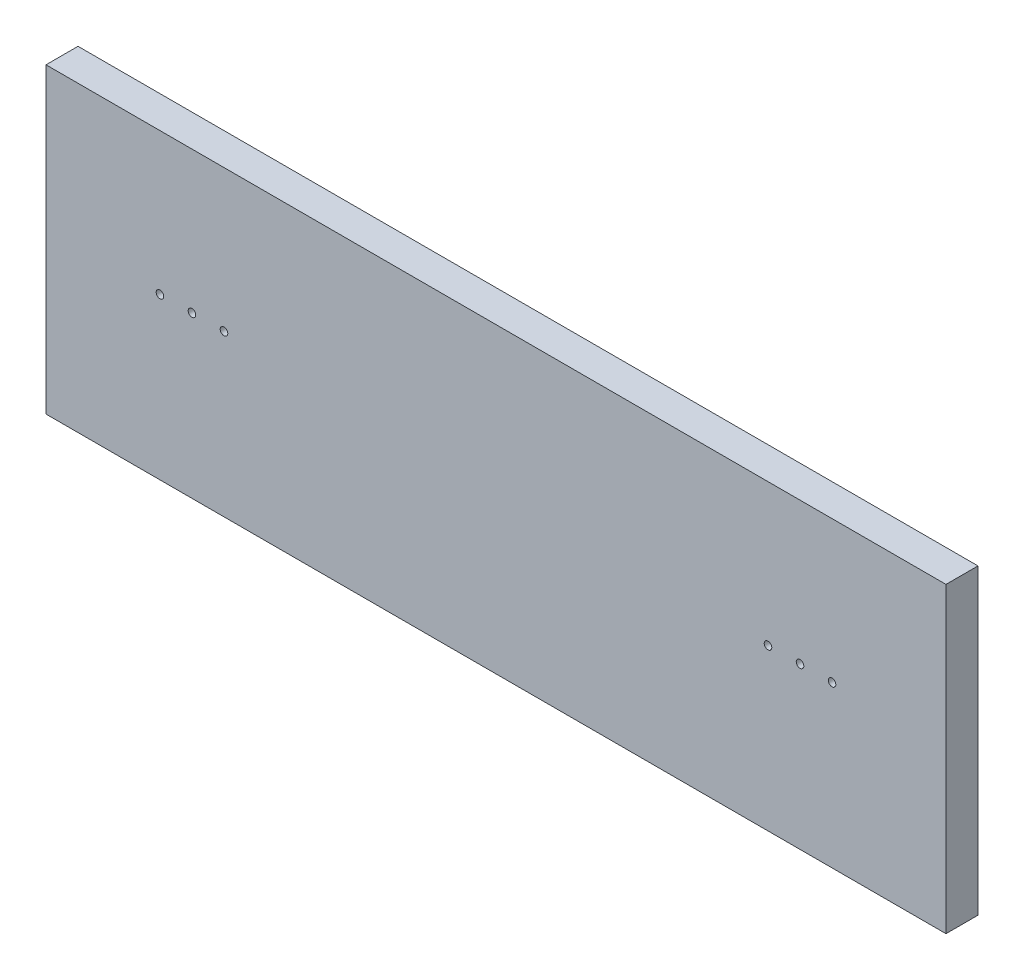
ISO-10303-21;
HEADER;
FILE_DESCRIPTION(('STEP AP214'),'2;1');
FILE_NAME('part.step','',(''),(''),'','','');
FILE_SCHEMA(('AUTOMOTIVE_DESIGN { 1 0 10303 214 1 1 1 1 }'));
ENDSEC;
DATA;
#1=APPLICATION_CONTEXT('core data for automotive mechanical design processes');
#2=APPLICATION_PROTOCOL_DEFINITION('international standard','automotive_design',2000,#1);
#3=PRODUCT_CONTEXT('',#1,'mechanical');
#4=PRODUCT('Part','Part','',(#3));
#5=PRODUCT_RELATED_PRODUCT_CATEGORY('part','',(#4));
#6=PRODUCT_DEFINITION_FORMATION('','',#4);
#7=PRODUCT_DEFINITION_CONTEXT('part definition',#1,'design');
#8=PRODUCT_DEFINITION('design','',#6,#7);
#9=PRODUCT_DEFINITION_SHAPE('','',#8);
#10=(LENGTH_UNIT() NAMED_UNIT(*) SI_UNIT(.MILLI.,.METRE.));
#11=(NAMED_UNIT(*) PLANE_ANGLE_UNIT() SI_UNIT($,.RADIAN.));
#12=(NAMED_UNIT(*) SI_UNIT($,.STERADIAN.) SOLID_ANGLE_UNIT());
#13=UNCERTAINTY_MEASURE_WITH_UNIT(LENGTH_MEASURE(1.E-05),#10,'distance_accuracy_value','');
#14=(GEOMETRIC_REPRESENTATION_CONTEXT(3) GLOBAL_UNCERTAINTY_ASSIGNED_CONTEXT((#13)) GLOBAL_UNIT_ASSIGNED_CONTEXT((#10,
#11,#12)) REPRESENTATION_CONTEXT('',''));
#15=CARTESIAN_POINT('',(0.,0.,0.));
#16=DIRECTION('',(0.,0.,1.));
#17=DIRECTION('',(1.,0.,0.));
#18=AXIS2_PLACEMENT_3D('',#15,#16,#17);
#19=CARTESIAN_POINT('',(178.5,60.,12.7));
#20=DIRECTION('',(-1.,0.,0.));
#21=DIRECTION('',(0.,-1.,0.));
#22=AXIS2_PLACEMENT_3D('',#19,#20,#21);
#23=PLANE('',#22);
#24=DIRECTION('',(0.,1.,0.));
#25=VECTOR('',#24,1.);
#26=CARTESIAN_POINT('',(178.5,60.,0.));
#27=LINE('',#26,#25);
#28=CARTESIAN_POINT('',(178.5,-60.,0.));
#29=VERTEX_POINT('',#28);
#30=CARTESIAN_POINT('',(178.5,60.,0.));
#31=VERTEX_POINT('',#30);
#32=EDGE_CURVE('E104',#29,#31,#27,.T.);
#33=ORIENTED_EDGE('',*,*,#32,.T.);
#34=DIRECTION('',(0.,0.,-1.));
#35=VECTOR('',#34,1.);
#36=CARTESIAN_POINT('',(178.5,60.,12.7));
#37=LINE('',#36,#35);
#38=CARTESIAN_POINT('',(178.5,60.,12.7));
#39=VERTEX_POINT('',#38);
#40=EDGE_CURVE('E11',#39,#31,#37,.T.);
#41=ORIENTED_EDGE('',*,*,#40,.F.);
#42=DIRECTION('',(0.,1.,0.));
#43=VECTOR('',#42,1.);
#44=CARTESIAN_POINT('',(178.5,60.,12.7));
#45=LINE('',#44,#43);
#46=CARTESIAN_POINT('',(178.5,-60.,12.7));
#47=VERTEX_POINT('',#46);
#48=EDGE_CURVE('E92',#47,#39,#45,.T.);
#49=ORIENTED_EDGE('',*,*,#48,.F.);
#50=DIRECTION('',(0.,0.,-1.));
#51=VECTOR('',#50,1.);
#52=CARTESIAN_POINT('',(178.5,-60.,12.7));
#53=LINE('',#52,#51);
#54=EDGE_CURVE('E100',#47,#29,#53,.T.);
#55=ORIENTED_EDGE('',*,*,#54,.T.);
#56=EDGE_LOOP('',(#33,#41,#49,#55));
#57=FACE_BOUND('',#56,.T.);
#58=ADVANCED_FACE('F41',(#57),#23,.F.);
#59=CARTESIAN_POINT('',(-178.5,60.,12.7));
#60=DIRECTION('',(0.,-1.,0.));
#61=DIRECTION('',(0.,0.,-1.));
#62=AXIS2_PLACEMENT_3D('',#59,#60,#61);
#63=PLANE('',#62);
#64=DIRECTION('',(-1.,0.,0.));
#65=VECTOR('',#64,1.);
#66=CARTESIAN_POINT('',(-178.5,60.,0.));
#67=LINE('',#66,#65);
#68=CARTESIAN_POINT('',(-178.5,60.,0.));
#69=VERTEX_POINT('',#68);
#70=EDGE_CURVE('E96',#31,#69,#67,.T.);
#71=ORIENTED_EDGE('',*,*,#70,.T.);
#72=DIRECTION('',(0.,0.,-1.));
#73=VECTOR('',#72,1.);
#74=CARTESIAN_POINT('',(-178.5,60.,12.7));
#75=LINE('',#74,#73);
#76=CARTESIAN_POINT('',(-178.5,60.,12.7));
#77=VERTEX_POINT('',#76);
#78=EDGE_CURVE('E49',#77,#69,#75,.T.);
#79=ORIENTED_EDGE('',*,*,#78,.F.);
#80=DIRECTION('',(-1.,0.,0.));
#81=VECTOR('',#80,1.);
#82=CARTESIAN_POINT('',(-178.5,60.,12.7));
#83=LINE('',#82,#81);
#84=EDGE_CURVE('E87',#39,#77,#83,.T.);
#85=ORIENTED_EDGE('',*,*,#84,.F.);
#86=ORIENTED_EDGE('',*,*,#40,.T.);
#87=EDGE_LOOP('',(#71,#79,#85,#86));
#88=FACE_BOUND('',#87,.T.);
#89=ADVANCED_FACE('F95',(#88),#63,.F.);
#90=CARTESIAN_POINT('',(-178.5,60.,12.7));
#91=DIRECTION('',(1.,0.,0.));
#92=DIRECTION('',(0.,0.,-1.));
#93=AXIS2_PLACEMENT_3D('',#90,#91,#92);
#94=PLANE('',#93);
#95=DIRECTION('',(0.,-1.,0.));
#96=VECTOR('',#95,1.);
#97=CARTESIAN_POINT('',(-178.5,60.,0.));
#98=LINE('',#97,#96);
#99=CARTESIAN_POINT('',(-178.5,-60.,0.));
#100=VERTEX_POINT('',#99);
#101=EDGE_CURVE('E74',#69,#100,#98,.T.);
#102=ORIENTED_EDGE('',*,*,#101,.T.);
#103=DIRECTION('',(0.,0.,-1.));
#104=VECTOR('',#103,1.);
#105=CARTESIAN_POINT('',(-178.5,-60.,12.7));
#106=LINE('',#105,#104);
#107=CARTESIAN_POINT('',(-178.5,-60.,12.7));
#108=VERTEX_POINT('',#107);
#109=EDGE_CURVE('E97',#108,#100,#106,.T.);
#110=ORIENTED_EDGE('',*,*,#109,.F.);
#111=DIRECTION('',(0.,-1.,0.));
#112=VECTOR('',#111,1.);
#113=CARTESIAN_POINT('',(-178.5,60.,12.7));
#114=LINE('',#113,#112);
#115=EDGE_CURVE('E90',#77,#108,#114,.T.);
#116=ORIENTED_EDGE('',*,*,#115,.F.);
#117=ORIENTED_EDGE('',*,*,#78,.T.);
#118=EDGE_LOOP('',(#102,#110,#116,#117));
#119=FACE_BOUND('',#118,.T.);
#120=ADVANCED_FACE('F98',(#119),#94,.F.);
#121=CARTESIAN_POINT('',(-178.5,-60.,12.7));
#122=DIRECTION('',(0.,1.,0.));
#123=DIRECTION('',(0.,0.,1.));
#124=AXIS2_PLACEMENT_3D('',#121,#122,#123);
#125=PLANE('',#124);
#126=DIRECTION('',(1.,0.,0.));
#127=VECTOR('',#126,1.);
#128=CARTESIAN_POINT('',(-178.5,-60.,0.));
#129=LINE('',#128,#127);
#130=EDGE_CURVE('E80',#100,#29,#129,.T.);
#131=ORIENTED_EDGE('',*,*,#130,.T.);
#132=ORIENTED_EDGE('',*,*,#54,.F.);
#133=DIRECTION('',(1.,0.,0.));
#134=VECTOR('',#133,1.);
#135=CARTESIAN_POINT('',(-178.5,-60.,12.7));
#136=LINE('',#135,#134);
#137=EDGE_CURVE('E57',#108,#47,#136,.T.);
#138=ORIENTED_EDGE('',*,*,#137,.F.);
#139=ORIENTED_EDGE('',*,*,#109,.T.);
#140=EDGE_LOOP('',(#131,#132,#138,#139));
#141=FACE_BOUND('',#140,.T.);
#142=ADVANCED_FACE('F112',(#141),#125,.F.);
#143=CARTESIAN_POINT('',(0.,0.,12.7));
#144=DIRECTION('',(0.,0.,1.));
#145=DIRECTION('',(1.,0.,0.));
#146=AXIS2_PLACEMENT_3D('',#143,#144,#145);
#147=PLANE('',#146);
#148=CARTESIAN_POINT('',(-133.3,3.71999999999999,12.7));
#149=DIRECTION('',(0.,0.,1.));
#150=DIRECTION('',(-1.,0.,0.));
#151=AXIS2_PLACEMENT_3D('',#148,#149,#150);
#152=CIRCLE('',#151,1.5);
#153=CARTESIAN_POINT('',(-134.8,3.71999999999999,12.7));
#154=VERTEX_POINT('',#153);
#155=EDGE_CURVE('E127',#154,#154,#152,.T.);
#156=ORIENTED_EDGE('',*,*,#155,.F.);
#157=EDGE_LOOP('',(#156));
#158=FACE_BOUND('',#157,.T.);
#159=CARTESIAN_POINT('',(-120.6,3.71999999999992,12.7));
#160=DIRECTION('',(0.,0.,1.));
#161=DIRECTION('',(-1.,0.,0.));
#162=AXIS2_PLACEMENT_3D('',#159,#160,#161);
#163=CIRCLE('',#162,1.5);
#164=CARTESIAN_POINT('',(-122.1,3.71999999999992,12.7));
#165=VERTEX_POINT('',#164);
#166=EDGE_CURVE('E133',#165,#165,#163,.T.);
#167=ORIENTED_EDGE('',*,*,#166,.F.);
#168=EDGE_LOOP('',(#167));
#169=FACE_BOUND('',#168,.T.);
#170=CARTESIAN_POINT('',(-107.9,3.71999999999983,12.7));
#171=DIRECTION('',(0.,0.,1.));
#172=DIRECTION('',(-1.,0.,0.));
#173=AXIS2_PLACEMENT_3D('',#170,#171,#172);
#174=CIRCLE('',#173,1.5);
#175=CARTESIAN_POINT('',(-109.4,3.71999999999983,12.7));
#176=VERTEX_POINT('',#175);
#177=EDGE_CURVE('E139',#176,#176,#174,.T.);
#178=ORIENTED_EDGE('',*,*,#177,.F.);
#179=EDGE_LOOP('',(#178));
#180=FACE_BOUND('',#179,.T.);
#181=CARTESIAN_POINT('',(133.3,3.71999999999999,12.7));
#182=DIRECTION('',(0.,0.,1.));
#183=DIRECTION('',(1.,0.,0.));
#184=AXIS2_PLACEMENT_3D('',#181,#182,#183);
#185=CIRCLE('',#184,1.5);
#186=CARTESIAN_POINT('',(134.8,3.71999999999999,12.7));
#187=VERTEX_POINT('',#186);
#188=EDGE_CURVE('E145',#187,#187,#185,.T.);
#189=ORIENTED_EDGE('',*,*,#188,.F.);
#190=EDGE_LOOP('',(#189));
#191=FACE_BOUND('',#190,.T.);
#192=CARTESIAN_POINT('',(107.9,3.71999999999986,12.7));
#193=DIRECTION('',(0.,0.,1.));
#194=DIRECTION('',(1.,0.,0.));
#195=AXIS2_PLACEMENT_3D('',#192,#193,#194);
#196=CIRCLE('',#195,1.5);
#197=CARTESIAN_POINT('',(109.4,3.71999999999986,12.7));
#198=VERTEX_POINT('',#197);
#199=EDGE_CURVE('E121',#198,#198,#196,.T.);
#200=ORIENTED_EDGE('',*,*,#199,.F.);
#201=EDGE_LOOP('',(#200));
#202=FACE_BOUND('',#201,.T.);
#203=CARTESIAN_POINT('',(120.6,3.71999999999995,12.7));
#204=DIRECTION('',(0.,0.,1.));
#205=DIRECTION('',(1.,0.,0.));
#206=AXIS2_PLACEMENT_3D('',#203,#204,#205);
#207=CIRCLE('',#206,1.5);
#208=CARTESIAN_POINT('',(122.1,3.71999999999995,12.7));
#209=VERTEX_POINT('',#208);
#210=EDGE_CURVE('E118',#209,#209,#207,.T.);
#211=ORIENTED_EDGE('',*,*,#210,.F.);
#212=EDGE_LOOP('',(#211));
#213=FACE_BOUND('',#212,.T.);
#214=ORIENTED_EDGE('',*,*,#48,.T.);
#215=ORIENTED_EDGE('',*,*,#84,.T.);
#216=ORIENTED_EDGE('',*,*,#115,.T.);
#217=ORIENTED_EDGE('',*,*,#137,.T.);
#218=EDGE_LOOP('',(#214,#215,#216,#217));
#219=FACE_BOUND('',#218,.T.);
#220=ADVANCED_FACE('F88',(#158,#169,#180,#191,#202,#213,#219),#147,.T.);
#221=CARTESIAN_POINT('',(0.,0.,0.));
#222=DIRECTION('',(0.,0.,1.));
#223=DIRECTION('',(1.,0.,0.));
#224=AXIS2_PLACEMENT_3D('',#221,#222,#223);
#225=PLANE('',#224);
#226=CARTESIAN_POINT('',(-133.3,3.71999999999999,0.));
#227=DIRECTION('',(0.,0.,1.));
#228=DIRECTION('',(-1.,0.,0.));
#229=AXIS2_PLACEMENT_3D('',#226,#227,#228);
#230=CIRCLE('',#229,1.5);
#231=CARTESIAN_POINT('',(-134.8,3.71999999999999,0.));
#232=VERTEX_POINT('',#231);
#233=EDGE_CURVE('E124',#232,#232,#230,.T.);
#234=ORIENTED_EDGE('',*,*,#233,.T.);
#235=EDGE_LOOP('',(#234));
#236=FACE_BOUND('',#235,.T.);
#237=CARTESIAN_POINT('',(-120.6,3.71999999999992,0.));
#238=DIRECTION('',(0.,0.,1.));
#239=DIRECTION('',(-1.,0.,0.));
#240=AXIS2_PLACEMENT_3D('',#237,#238,#239);
#241=CIRCLE('',#240,1.5);
#242=CARTESIAN_POINT('',(-122.1,3.71999999999992,0.));
#243=VERTEX_POINT('',#242);
#244=EDGE_CURVE('E130',#243,#243,#241,.T.);
#245=ORIENTED_EDGE('',*,*,#244,.T.);
#246=EDGE_LOOP('',(#245));
#247=FACE_BOUND('',#246,.T.);
#248=CARTESIAN_POINT('',(-107.9,3.71999999999983,0.));
#249=DIRECTION('',(0.,0.,1.));
#250=DIRECTION('',(-1.,0.,0.));
#251=AXIS2_PLACEMENT_3D('',#248,#249,#250);
#252=CIRCLE('',#251,1.5);
#253=CARTESIAN_POINT('',(-109.4,3.71999999999983,0.));
#254=VERTEX_POINT('',#253);
#255=EDGE_CURVE('E136',#254,#254,#252,.T.);
#256=ORIENTED_EDGE('',*,*,#255,.T.);
#257=EDGE_LOOP('',(#256));
#258=FACE_BOUND('',#257,.T.);
#259=CARTESIAN_POINT('',(133.3,3.71999999999999,0.));
#260=DIRECTION('',(0.,0.,1.));
#261=DIRECTION('',(1.,0.,0.));
#262=AXIS2_PLACEMENT_3D('',#259,#260,#261);
#263=CIRCLE('',#262,1.5);
#264=CARTESIAN_POINT('',(134.8,3.71999999999999,0.));
#265=VERTEX_POINT('',#264);
#266=EDGE_CURVE('E142',#265,#265,#263,.T.);
#267=ORIENTED_EDGE('',*,*,#266,.T.);
#268=EDGE_LOOP('',(#267));
#269=FACE_BOUND('',#268,.T.);
#270=CARTESIAN_POINT('',(107.9,3.71999999999986,0.));
#271=DIRECTION('',(0.,0.,1.));
#272=DIRECTION('',(1.,0.,0.));
#273=AXIS2_PLACEMENT_3D('',#270,#271,#272);
#274=CIRCLE('',#273,1.5);
#275=CARTESIAN_POINT('',(109.4,3.71999999999986,0.));
#276=VERTEX_POINT('',#275);
#277=EDGE_CURVE('E148',#276,#276,#274,.T.);
#278=ORIENTED_EDGE('',*,*,#277,.T.);
#279=EDGE_LOOP('',(#278));
#280=FACE_BOUND('',#279,.T.);
#281=CARTESIAN_POINT('',(120.6,3.71999999999995,0.));
#282=DIRECTION('',(0.,0.,1.));
#283=DIRECTION('',(1.,0.,0.));
#284=AXIS2_PLACEMENT_3D('',#281,#282,#283);
#285=CIRCLE('',#284,1.5);
#286=CARTESIAN_POINT('',(122.1,3.71999999999995,0.));
#287=VERTEX_POINT('',#286);
#288=EDGE_CURVE('E107',#287,#287,#285,.T.);
#289=ORIENTED_EDGE('',*,*,#288,.T.);
#290=EDGE_LOOP('',(#289));
#291=FACE_BOUND('',#290,.T.);
#292=ORIENTED_EDGE('',*,*,#32,.F.);
#293=ORIENTED_EDGE('',*,*,#130,.F.);
#294=ORIENTED_EDGE('',*,*,#101,.F.);
#295=ORIENTED_EDGE('',*,*,#70,.F.);
#296=EDGE_LOOP('',(#292,#293,#294,#295));
#297=FACE_BOUND('',#296,.T.);
#298=ADVANCED_FACE('F115',(#236,#247,#258,#269,#280,#291,#297),#225,.F.);
#299=CARTESIAN_POINT('',(120.6,3.71999999999995,0.));
#300=DIRECTION('',(0.,0.,1.));
#301=DIRECTION('',(1.,0.,0.));
#302=AXIS2_PLACEMENT_3D('',#299,#300,#301);
#303=CYLINDRICAL_SURFACE('',#302,1.5);
#304=ORIENTED_EDGE('',*,*,#288,.F.);
#305=EDGE_LOOP('',(#304));
#306=FACE_BOUND('',#305,.T.);
#307=ORIENTED_EDGE('',*,*,#210,.T.);
#308=EDGE_LOOP('',(#307));
#309=FACE_BOUND('',#308,.T.);
#310=ADVANCED_FACE('F162',(#306,#309),#303,.F.);
#311=CARTESIAN_POINT('',(107.9,3.71999999999986,0.));
#312=DIRECTION('',(0.,0.,1.));
#313=DIRECTION('',(1.,0.,0.));
#314=AXIS2_PLACEMENT_3D('',#311,#312,#313);
#315=CYLINDRICAL_SURFACE('',#314,1.5);
#316=ORIENTED_EDGE('',*,*,#277,.F.);
#317=EDGE_LOOP('',(#316));
#318=FACE_BOUND('',#317,.T.);
#319=ORIENTED_EDGE('',*,*,#199,.T.);
#320=EDGE_LOOP('',(#319));
#321=FACE_BOUND('',#320,.T.);
#322=ADVANCED_FACE('F154',(#318,#321),#315,.F.);
#323=CARTESIAN_POINT('',(133.3,3.71999999999999,0.));
#324=DIRECTION('',(0.,0.,1.));
#325=DIRECTION('',(1.,0.,0.));
#326=AXIS2_PLACEMENT_3D('',#323,#324,#325);
#327=CYLINDRICAL_SURFACE('',#326,1.5);
#328=ORIENTED_EDGE('',*,*,#266,.F.);
#329=EDGE_LOOP('',(#328));
#330=FACE_BOUND('',#329,.T.);
#331=ORIENTED_EDGE('',*,*,#188,.T.);
#332=EDGE_LOOP('',(#331));
#333=FACE_BOUND('',#332,.T.);
#334=ADVANCED_FACE('F170',(#330,#333),#327,.F.);
#335=CARTESIAN_POINT('',(-107.9,3.71999999999983,0.));
#336=DIRECTION('',(0.,0.,1.));
#337=DIRECTION('',(1.,0.,0.));
#338=AXIS2_PLACEMENT_3D('',#335,#336,#337);
#339=CYLINDRICAL_SURFACE('',#338,1.5);
#340=ORIENTED_EDGE('',*,*,#255,.F.);
#341=EDGE_LOOP('',(#340));
#342=FACE_BOUND('',#341,.T.);
#343=ORIENTED_EDGE('',*,*,#177,.T.);
#344=EDGE_LOOP('',(#343));
#345=FACE_BOUND('',#344,.T.);
#346=ADVANCED_FACE('F221',(#342,#345),#339,.F.);
#347=CARTESIAN_POINT('',(-120.6,3.71999999999992,0.));
#348=DIRECTION('',(0.,0.,1.));
#349=DIRECTION('',(1.,0.,0.));
#350=AXIS2_PLACEMENT_3D('',#347,#348,#349);
#351=CYLINDRICAL_SURFACE('',#350,1.5);
#352=ORIENTED_EDGE('',*,*,#244,.F.);
#353=EDGE_LOOP('',(#352));
#354=FACE_BOUND('',#353,.T.);
#355=ORIENTED_EDGE('',*,*,#166,.T.);
#356=EDGE_LOOP('',(#355));
#357=FACE_BOUND('',#356,.T.);
#358=ADVANCED_FACE('F231',(#354,#357),#351,.F.);
#359=CARTESIAN_POINT('',(-133.3,3.71999999999999,0.));
#360=DIRECTION('',(0.,0.,1.));
#361=DIRECTION('',(1.,0.,0.));
#362=AXIS2_PLACEMENT_3D('',#359,#360,#361);
#363=CYLINDRICAL_SURFACE('',#362,1.5);
#364=ORIENTED_EDGE('',*,*,#233,.F.);
#365=EDGE_LOOP('',(#364));
#366=FACE_BOUND('',#365,.T.);
#367=ORIENTED_EDGE('',*,*,#155,.T.);
#368=EDGE_LOOP('',(#367));
#369=FACE_BOUND('',#368,.T.);
#370=ADVANCED_FACE('F241',(#366,#369),#363,.F.);
#371=CLOSED_SHELL('',(#58,#89,#120,#142,#220,#298,#310,#322,#334,#346,#358,#370));
#372=MANIFOLD_SOLID_BREP('B2',#371);
#373=ADVANCED_BREP_SHAPE_REPRESENTATION('',(#18,#372),#14);
#374=SHAPE_DEFINITION_REPRESENTATION(#9,#373);
ENDSEC;
END-ISO-10303-21;
